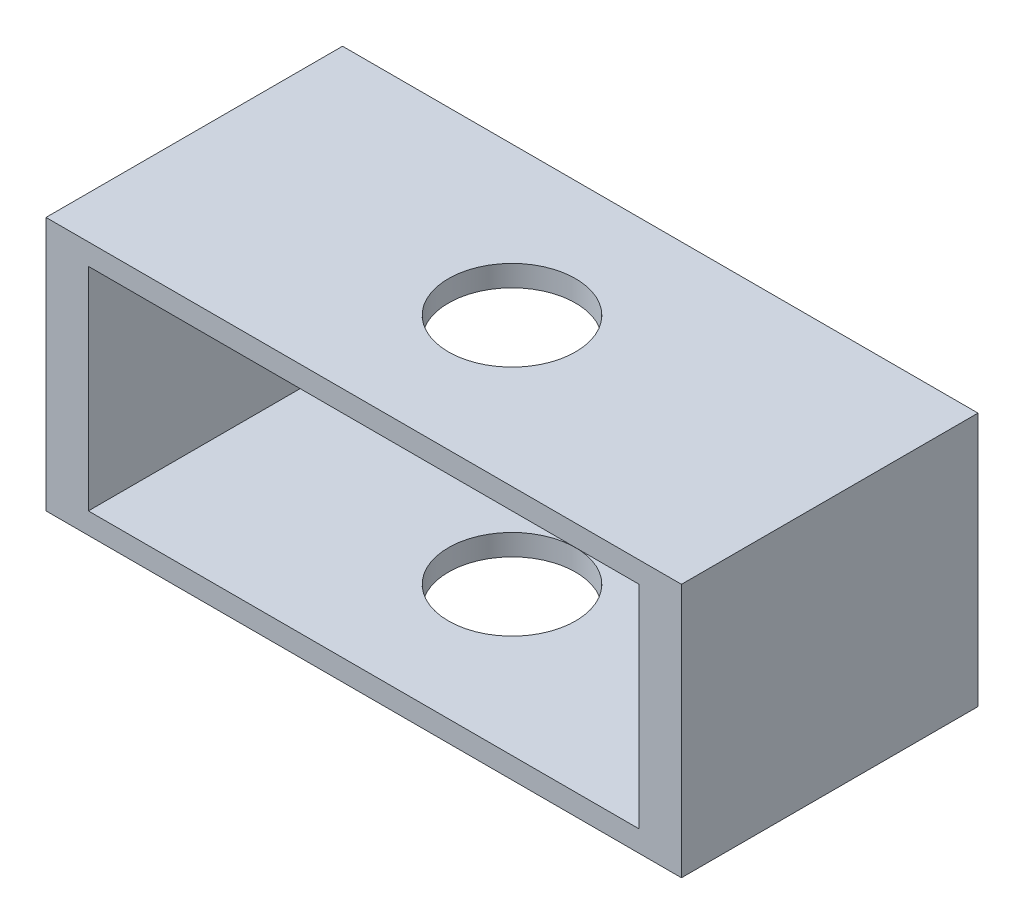
ISO-10303-21;
HEADER;
FILE_DESCRIPTION(('STEP AP214'),'2;1');
FILE_NAME('part.step','',(''),(''),'','','');
FILE_SCHEMA(('AUTOMOTIVE_DESIGN { 1 0 10303 214 1 1 1 1 }'));
ENDSEC;
DATA;
#1=APPLICATION_CONTEXT('core data for automotive mechanical design processes');
#2=APPLICATION_PROTOCOL_DEFINITION('international standard','automotive_design',2000,#1);
#3=PRODUCT_CONTEXT('',#1,'mechanical');
#4=PRODUCT('Part','Part','',(#3));
#5=PRODUCT_RELATED_PRODUCT_CATEGORY('part','',(#4));
#6=PRODUCT_DEFINITION_FORMATION('','',#4);
#7=PRODUCT_DEFINITION_CONTEXT('part definition',#1,'design');
#8=PRODUCT_DEFINITION('design','',#6,#7);
#9=PRODUCT_DEFINITION_SHAPE('','',#8);
#10=(LENGTH_UNIT() NAMED_UNIT(*) SI_UNIT(.MILLI.,.METRE.));
#11=(NAMED_UNIT(*) PLANE_ANGLE_UNIT() SI_UNIT($,.RADIAN.));
#12=(NAMED_UNIT(*) SI_UNIT($,.STERADIAN.) SOLID_ANGLE_UNIT());
#13=UNCERTAINTY_MEASURE_WITH_UNIT(LENGTH_MEASURE(1.E-05),#10,'distance_accuracy_value','');
#14=(GEOMETRIC_REPRESENTATION_CONTEXT(3) GLOBAL_UNCERTAINTY_ASSIGNED_CONTEXT((#13)) GLOBAL_UNIT_ASSIGNED_CONTEXT((#10,
#11,#12)) REPRESENTATION_CONTEXT('',''));
#15=CARTESIAN_POINT('',(0.,0.,0.));
#16=DIRECTION('',(0.,0.,1.));
#17=DIRECTION('',(1.,0.,0.));
#18=AXIS2_PLACEMENT_3D('',#15,#16,#17);
#19=CARTESIAN_POINT('',(0.,1.,0.));
#20=DIRECTION('',(0.,-1.,0.));
#21=DIRECTION('',(0.,0.,-1.));
#22=AXIS2_PLACEMENT_3D('',#19,#20,#21);
#23=PLANE('',#22);
#24=CARTESIAN_POINT('',(0.,1.,0.));
#25=DIRECTION('',(0.,1.,0.));
#26=DIRECTION('',(0.,0.,1.));
#27=AXIS2_PLACEMENT_3D('',#24,#25,#26);
#28=CIRCLE('',#27,3.);
#29=CARTESIAN_POINT('',(0.,1.,2.99999999999999));
#30=VERTEX_POINT('',#29);
#31=EDGE_CURVE('E160',#30,#30,#28,.T.);
#32=ORIENTED_EDGE('',*,*,#31,.F.);
#33=EDGE_LOOP('',(#32));
#34=FACE_BOUND('',#33,.T.);
#35=DIRECTION('',(1.,0.,0.));
#36=VECTOR('',#35,1.);
#37=CARTESIAN_POINT('',(-15.,1.,6.99999999999999));
#38=LINE('',#37,#36);
#39=CARTESIAN_POINT('',(-13.,1.,6.99999999999999));
#40=VERTEX_POINT('',#39);
#41=CARTESIAN_POINT('',(12.9999999999999,1.,6.99999999999999));
#42=VERTEX_POINT('',#41);
#43=EDGE_CURVE('E58',#40,#42,#38,.T.);
#44=ORIENTED_EDGE('',*,*,#43,.T.);
#45=DIRECTION('',(0.,0.,-1.));
#46=VECTOR('',#45,1.);
#47=CARTESIAN_POINT('',(13.,1.,0.));
#48=LINE('',#47,#46);
#49=CARTESIAN_POINT('',(12.9999999999999,1.,-7.00000000000001));
#50=VERTEX_POINT('',#49);
#51=EDGE_CURVE('E53',#42,#50,#48,.T.);
#52=ORIENTED_EDGE('',*,*,#51,.T.);
#53=DIRECTION('',(-1.,0.,0.));
#54=VECTOR('',#53,1.);
#55=CARTESIAN_POINT('',(-15.,1.,-7.00000000000001));
#56=LINE('',#55,#54);
#57=CARTESIAN_POINT('',(-13.,1.,-7.00000000000001));
#58=VERTEX_POINT('',#57);
#59=EDGE_CURVE('E165',#50,#58,#56,.T.);
#60=ORIENTED_EDGE('',*,*,#59,.T.);
#61=DIRECTION('',(0.,0.,-1.));
#62=VECTOR('',#61,1.);
#63=CARTESIAN_POINT('',(-13.,1.,0.));
#64=LINE('',#63,#62);
#65=EDGE_CURVE('E147',#40,#58,#64,.T.);
#66=ORIENTED_EDGE('',*,*,#65,.F.);
#67=EDGE_LOOP('',(#44,#52,#60,#66));
#68=FACE_BOUND('',#67,.T.);
#69=ADVANCED_FACE('F38',(#34,#68),#23,.F.);
#70=CARTESIAN_POINT('',(0.,0.,0.));
#71=DIRECTION('',(0.,-1.,0.));
#72=DIRECTION('',(0.,0.,-1.));
#73=AXIS2_PLACEMENT_3D('',#70,#71,#72);
#74=PLANE('',#73);
#75=DIRECTION('',(0.,0.,-1.));
#76=VECTOR('',#75,1.);
#77=CARTESIAN_POINT('',(15.,0.,6.99999999999999));
#78=LINE('',#77,#76);
#79=CARTESIAN_POINT('',(15.,0.,6.99999999999999));
#80=VERTEX_POINT('',#79);
#81=CARTESIAN_POINT('',(15.,0.,-7.00000000000001));
#82=VERTEX_POINT('',#81);
#83=EDGE_CURVE('E107',#80,#82,#78,.T.);
#84=ORIENTED_EDGE('',*,*,#83,.F.);
#85=DIRECTION('',(1.,0.,0.));
#86=VECTOR('',#85,1.);
#87=CARTESIAN_POINT('',(-15.,0.,6.99999999999999));
#88=LINE('',#87,#86);
#89=CARTESIAN_POINT('',(-15.,0.,6.99999999999999));
#90=VERTEX_POINT('',#89);
#91=EDGE_CURVE('E167',#90,#80,#88,.T.);
#92=ORIENTED_EDGE('',*,*,#91,.F.);
#93=DIRECTION('',(0.,0.,1.));
#94=VECTOR('',#93,1.);
#95=CARTESIAN_POINT('',(-15.,0.,6.99999999999999));
#96=LINE('',#95,#94);
#97=CARTESIAN_POINT('',(-15.,0.,-7.00000000000001));
#98=VERTEX_POINT('',#97);
#99=EDGE_CURVE('E173',#98,#90,#96,.T.);
#100=ORIENTED_EDGE('',*,*,#99,.F.);
#101=DIRECTION('',(-1.,0.,0.));
#102=VECTOR('',#101,1.);
#103=CARTESIAN_POINT('',(-15.,0.,-7.00000000000001));
#104=LINE('',#103,#102);
#105=EDGE_CURVE('E171',#82,#98,#104,.T.);
#106=ORIENTED_EDGE('',*,*,#105,.F.);
#107=EDGE_LOOP('',(#84,#92,#100,#106));
#108=FACE_BOUND('',#107,.T.);
#109=CARTESIAN_POINT('',(0.,0.,0.));
#110=DIRECTION('',(0.,1.,0.));
#111=DIRECTION('',(0.,0.,1.));
#112=AXIS2_PLACEMENT_3D('',#109,#110,#111);
#113=CIRCLE('',#112,3.);
#114=CARTESIAN_POINT('',(0.,0.,2.99999999999999));
#115=VERTEX_POINT('',#114);
#116=EDGE_CURVE('E159',#115,#115,#113,.T.);
#117=ORIENTED_EDGE('',*,*,#116,.T.);
#118=EDGE_LOOP('',(#117));
#119=FACE_BOUND('',#118,.T.);
#120=ADVANCED_FACE('F184',(#108,#119),#74,.T.);
#121=CARTESIAN_POINT('',(15.,1.,6.99999999999999));
#122=DIRECTION('',(-1.,0.,0.));
#123=DIRECTION('',(0.,0.,1.));
#124=AXIS2_PLACEMENT_3D('',#121,#122,#123);
#125=PLANE('',#124);
#126=ORIENTED_EDGE('',*,*,#83,.T.);
#127=DIRECTION('',(0.,-1.,0.));
#128=VECTOR('',#127,1.);
#129=CARTESIAN_POINT('',(15.,1.,-7.00000000000001));
#130=LINE('',#129,#128);
#131=CARTESIAN_POINT('',(15.,12.,-7.00000000000001));
#132=VERTEX_POINT('',#131);
#133=EDGE_CURVE('E11',#132,#82,#130,.T.);
#134=ORIENTED_EDGE('',*,*,#133,.F.);
#135=DIRECTION('',(0.,0.,-1.));
#136=VECTOR('',#135,1.);
#137=CARTESIAN_POINT('',(15.,12.,7.00000000000001));
#138=LINE('',#137,#136);
#139=CARTESIAN_POINT('',(15.,12.,7.00000000000001));
#140=VERTEX_POINT('',#139);
#141=EDGE_CURVE('E105',#140,#132,#138,.T.);
#142=ORIENTED_EDGE('',*,*,#141,.F.);
#143=DIRECTION('',(0.,-1.,0.));
#144=VECTOR('',#143,1.);
#145=CARTESIAN_POINT('',(15.,1.,6.99999999999999));
#146=LINE('',#145,#144);
#147=EDGE_CURVE('E169',#140,#80,#146,.T.);
#148=ORIENTED_EDGE('',*,*,#147,.T.);
#149=EDGE_LOOP('',(#126,#134,#142,#148));
#150=FACE_BOUND('',#149,.T.);
#151=ADVANCED_FACE('F40',(#150),#125,.F.);
#152=CARTESIAN_POINT('',(-15.,1.,-7.00000000000001));
#153=DIRECTION('',(0.,0.,1.));
#154=DIRECTION('',(1.,0.,0.));
#155=AXIS2_PLACEMENT_3D('',#152,#153,#154);
#156=PLANE('',#155);
#157=DIRECTION('',(0.,-1.,0.));
#158=VECTOR('',#157,1.);
#159=CARTESIAN_POINT('',(-15.,1.,-7.00000000000001));
#160=LINE('',#159,#158);
#161=CARTESIAN_POINT('',(-15.,12.,-7.00000000000001));
#162=VERTEX_POINT('',#161);
#163=EDGE_CURVE('E46',#162,#98,#160,.T.);
#164=ORIENTED_EDGE('',*,*,#163,.F.);
#165=DIRECTION('',(-1.,0.,0.));
#166=VECTOR('',#165,1.);
#167=CARTESIAN_POINT('',(-15.,12.,-7.00000000000001));
#168=LINE('',#167,#166);
#169=EDGE_CURVE('E110',#132,#162,#168,.T.);
#170=ORIENTED_EDGE('',*,*,#169,.F.);
#171=ORIENTED_EDGE('',*,*,#133,.T.);
#172=ORIENTED_EDGE('',*,*,#105,.T.);
#173=EDGE_LOOP('',(#164,#170,#171,#172));
#174=FACE_BOUND('',#173,.T.);
#175=DIRECTION('',(-1.,0.,0.));
#176=VECTOR('',#175,1.);
#177=CARTESIAN_POINT('',(-15.,11.,-7.00000000000001));
#178=LINE('',#177,#176);
#179=CARTESIAN_POINT('',(12.9999999999999,11.,-7.00000000000001));
#180=VERTEX_POINT('',#179);
#181=CARTESIAN_POINT('',(-13.,11.,-7.00000000000001));
#182=VERTEX_POINT('',#181);
#183=EDGE_CURVE('E127',#180,#182,#178,.T.);
#184=ORIENTED_EDGE('',*,*,#183,.T.);
#185=DIRECTION('',(0.,-1.,0.));
#186=VECTOR('',#185,1.);
#187=CARTESIAN_POINT('',(-13.,11.,-7.00000000000001));
#188=LINE('',#187,#186);
#189=EDGE_CURVE('E151',#182,#58,#188,.T.);
#190=ORIENTED_EDGE('',*,*,#189,.T.);
#191=ORIENTED_EDGE('',*,*,#59,.F.);
#192=DIRECTION('',(0.,-1.,0.));
#193=VECTOR('',#192,1.);
#194=CARTESIAN_POINT('',(12.9999999999999,11.,-7.00000000000001));
#195=LINE('',#194,#193);
#196=EDGE_CURVE('E141',#180,#50,#195,.T.);
#197=ORIENTED_EDGE('',*,*,#196,.F.);
#198=EDGE_LOOP('',(#184,#190,#191,#197));
#199=FACE_BOUND('',#198,.T.);
#200=ADVANCED_FACE('F111',(#174,#199),#156,.F.);
#201=CARTESIAN_POINT('',(-15.,1.,6.99999999999999));
#202=DIRECTION('',(1.,0.,0.));
#203=DIRECTION('',(0.,0.,-1.));
#204=AXIS2_PLACEMENT_3D('',#201,#202,#203);
#205=PLANE('',#204);
#206=ORIENTED_EDGE('',*,*,#99,.T.);
#207=DIRECTION('',(0.,-1.,0.));
#208=VECTOR('',#207,1.);
#209=CARTESIAN_POINT('',(-15.,1.,6.99999999999999));
#210=LINE('',#209,#208);
#211=CARTESIAN_POINT('',(-15.,12.,7.00000000000001));
#212=VERTEX_POINT('',#211);
#213=EDGE_CURVE('E177',#212,#90,#210,.T.);
#214=ORIENTED_EDGE('',*,*,#213,.F.);
#215=DIRECTION('',(0.,0.,1.));
#216=VECTOR('',#215,1.);
#217=CARTESIAN_POINT('',(-15.,12.,7.00000000000001));
#218=LINE('',#217,#216);
#219=EDGE_CURVE('E117',#162,#212,#218,.T.);
#220=ORIENTED_EDGE('',*,*,#219,.F.);
#221=ORIENTED_EDGE('',*,*,#163,.T.);
#222=EDGE_LOOP('',(#206,#214,#220,#221));
#223=FACE_BOUND('',#222,.T.);
#224=ADVANCED_FACE('F181',(#223),#205,.F.);
#225=CARTESIAN_POINT('',(-15.,1.,6.99999999999999));
#226=DIRECTION('',(0.,0.,-1.));
#227=DIRECTION('',(-1.,0.,0.));
#228=AXIS2_PLACEMENT_3D('',#225,#226,#227);
#229=PLANE('',#228);
#230=DIRECTION('',(0.,-1.,0.));
#231=VECTOR('',#230,1.);
#232=CARTESIAN_POINT('',(-13.,11.,6.99999999999999));
#233=LINE('',#232,#231);
#234=CARTESIAN_POINT('',(-13.,11.,7.00000000000001));
#235=VERTEX_POINT('',#234);
#236=EDGE_CURVE('E156',#235,#40,#233,.T.);
#237=ORIENTED_EDGE('',*,*,#236,.F.);
#238=DIRECTION('',(1.,0.,0.));
#239=VECTOR('',#238,1.);
#240=CARTESIAN_POINT('',(-15.,11.,7.00000000000001));
#241=LINE('',#240,#239);
#242=CARTESIAN_POINT('',(13.,11.,6.99999999999999));
#243=VERTEX_POINT('',#242);
#244=EDGE_CURVE('E124',#235,#243,#241,.T.);
#245=ORIENTED_EDGE('',*,*,#244,.T.);
#246=DIRECTION('',(0.,-1.,0.));
#247=VECTOR('',#246,1.);
#248=CARTESIAN_POINT('',(13.,11.,6.99999999999999));
#249=LINE('',#248,#247);
#250=EDGE_CURVE('E145',#243,#42,#249,.T.);
#251=ORIENTED_EDGE('',*,*,#250,.T.);
#252=ORIENTED_EDGE('',*,*,#43,.F.);
#253=EDGE_LOOP('',(#237,#245,#251,#252));
#254=FACE_BOUND('',#253,.T.);
#255=ORIENTED_EDGE('',*,*,#91,.T.);
#256=ORIENTED_EDGE('',*,*,#147,.F.);
#257=DIRECTION('',(1.,0.,0.));
#258=VECTOR('',#257,1.);
#259=CARTESIAN_POINT('',(-15.,12.,7.00000000000001));
#260=LINE('',#259,#258);
#261=EDGE_CURVE('E123',#212,#140,#260,.T.);
#262=ORIENTED_EDGE('',*,*,#261,.F.);
#263=ORIENTED_EDGE('',*,*,#213,.T.);
#264=EDGE_LOOP('',(#255,#256,#262,#263));
#265=FACE_BOUND('',#264,.T.);
#266=ADVANCED_FACE('F187',(#254,#265),#229,.F.);
#267=CARTESIAN_POINT('',(0.,1.,0.));
#268=DIRECTION('',(0.,-1.,0.));
#269=DIRECTION('',(0.,0.,-1.));
#270=AXIS2_PLACEMENT_3D('',#267,#268,#269);
#271=CYLINDRICAL_SURFACE('',#270,3.);
#272=ORIENTED_EDGE('',*,*,#31,.T.);
#273=EDGE_LOOP('',(#272));
#274=FACE_BOUND('',#273,.T.);
#275=ORIENTED_EDGE('',*,*,#116,.F.);
#276=EDGE_LOOP('',(#275));
#277=FACE_BOUND('',#276,.T.);
#278=ADVANCED_FACE('F189',(#274,#277),#271,.F.);
#279=CARTESIAN_POINT('',(-13.,11.,0.));
#280=DIRECTION('',(-1.,0.,0.));
#281=DIRECTION('',(0.,0.,1.));
#282=AXIS2_PLACEMENT_3D('',#279,#280,#281);
#283=PLANE('',#282);
#284=ORIENTED_EDGE('',*,*,#65,.T.);
#285=ORIENTED_EDGE('',*,*,#189,.F.);
#286=DIRECTION('',(0.,0.,-1.));
#287=VECTOR('',#286,1.);
#288=CARTESIAN_POINT('',(-13.,11.,0.));
#289=LINE('',#288,#287);
#290=EDGE_CURVE('E148',#235,#182,#289,.T.);
#291=ORIENTED_EDGE('',*,*,#290,.F.);
#292=ORIENTED_EDGE('',*,*,#236,.T.);
#293=EDGE_LOOP('',(#284,#285,#291,#292));
#294=FACE_BOUND('',#293,.T.);
#295=ADVANCED_FACE('F196',(#294),#283,.F.);
#296=CARTESIAN_POINT('',(13.,11.,0.));
#297=DIRECTION('',(-1.,0.,0.));
#298=DIRECTION('',(0.,0.,1.));
#299=AXIS2_PLACEMENT_3D('',#296,#297,#298);
#300=PLANE('',#299);
#301=ORIENTED_EDGE('',*,*,#51,.F.);
#302=ORIENTED_EDGE('',*,*,#250,.F.);
#303=DIRECTION('',(0.,0.,-1.));
#304=VECTOR('',#303,1.);
#305=CARTESIAN_POINT('',(13.,11.,0.));
#306=LINE('',#305,#304);
#307=EDGE_CURVE('E138',#243,#180,#306,.T.);
#308=ORIENTED_EDGE('',*,*,#307,.T.);
#309=ORIENTED_EDGE('',*,*,#196,.T.);
#310=EDGE_LOOP('',(#301,#302,#308,#309));
#311=FACE_BOUND('',#310,.T.);
#312=ADVANCED_FACE('F211',(#311),#300,.T.);
#313=CARTESIAN_POINT('',(0.,11.,0.));
#314=DIRECTION('',(0.,-1.,0.));
#315=DIRECTION('',(0.,0.,-1.));
#316=AXIS2_PLACEMENT_3D('',#313,#314,#315);
#317=PLANE('',#316);
#318=CARTESIAN_POINT('',(0.,11.,0.));
#319=DIRECTION('',(0.,1.,0.));
#320=DIRECTION('',(0.,0.,1.));
#321=AXIS2_PLACEMENT_3D('',#318,#319,#320);
#322=CIRCLE('',#321,3.);
#323=CARTESIAN_POINT('',(0.,11.,3.));
#324=VERTEX_POINT('',#323);
#325=EDGE_CURVE('E130',#324,#324,#322,.T.);
#326=ORIENTED_EDGE('',*,*,#325,.T.);
#327=EDGE_LOOP('',(#326));
#328=FACE_BOUND('',#327,.T.);
#329=ORIENTED_EDGE('',*,*,#290,.T.);
#330=ORIENTED_EDGE('',*,*,#183,.F.);
#331=ORIENTED_EDGE('',*,*,#307,.F.);
#332=ORIENTED_EDGE('',*,*,#244,.F.);
#333=EDGE_LOOP('',(#329,#330,#331,#332));
#334=FACE_BOUND('',#333,.T.);
#335=ADVANCED_FACE('F215',(#328,#334),#317,.T.);
#336=CARTESIAN_POINT('',(0.,12.,0.));
#337=DIRECTION('',(0.,-1.,0.));
#338=DIRECTION('',(0.,0.,-1.));
#339=AXIS2_PLACEMENT_3D('',#336,#337,#338);
#340=PLANE('',#339);
#341=ORIENTED_EDGE('',*,*,#141,.T.);
#342=ORIENTED_EDGE('',*,*,#169,.T.);
#343=ORIENTED_EDGE('',*,*,#219,.T.);
#344=ORIENTED_EDGE('',*,*,#261,.T.);
#345=EDGE_LOOP('',(#341,#342,#343,#344));
#346=FACE_BOUND('',#345,.T.);
#347=CARTESIAN_POINT('',(0.,12.,0.));
#348=DIRECTION('',(0.,1.,0.));
#349=DIRECTION('',(0.,0.,1.));
#350=AXIS2_PLACEMENT_3D('',#347,#348,#349);
#351=CIRCLE('',#350,3.);
#352=CARTESIAN_POINT('',(0.,12.,3.));
#353=VERTEX_POINT('',#352);
#354=EDGE_CURVE('E136',#353,#353,#351,.T.);
#355=ORIENTED_EDGE('',*,*,#354,.F.);
#356=EDGE_LOOP('',(#355));
#357=FACE_BOUND('',#356,.T.);
#358=ADVANCED_FACE('F120',(#346,#357),#340,.F.);
#359=CARTESIAN_POINT('',(0.,12.,0.));
#360=DIRECTION('',(0.,-1.,0.));
#361=DIRECTION('',(0.,0.,-1.));
#362=AXIS2_PLACEMENT_3D('',#359,#360,#361);
#363=CYLINDRICAL_SURFACE('',#362,3.);
#364=ORIENTED_EDGE('',*,*,#354,.T.);
#365=EDGE_LOOP('',(#364));
#366=FACE_BOUND('',#365,.T.);
#367=ORIENTED_EDGE('',*,*,#325,.F.);
#368=EDGE_LOOP('',(#367));
#369=FACE_BOUND('',#368,.T.);
#370=ADVANCED_FACE('F222',(#366,#369),#363,.F.);
#371=CLOSED_SHELL('',(#69,#120,#151,#200,#224,#266,#278,#295,#312,#335,#358,#370));
#372=MANIFOLD_SOLID_BREP('B2',#371);
#373=ADVANCED_BREP_SHAPE_REPRESENTATION('',(#18,#372),#14);
#374=SHAPE_DEFINITION_REPRESENTATION(#9,#373);
ENDSEC;
END-ISO-10303-21;
